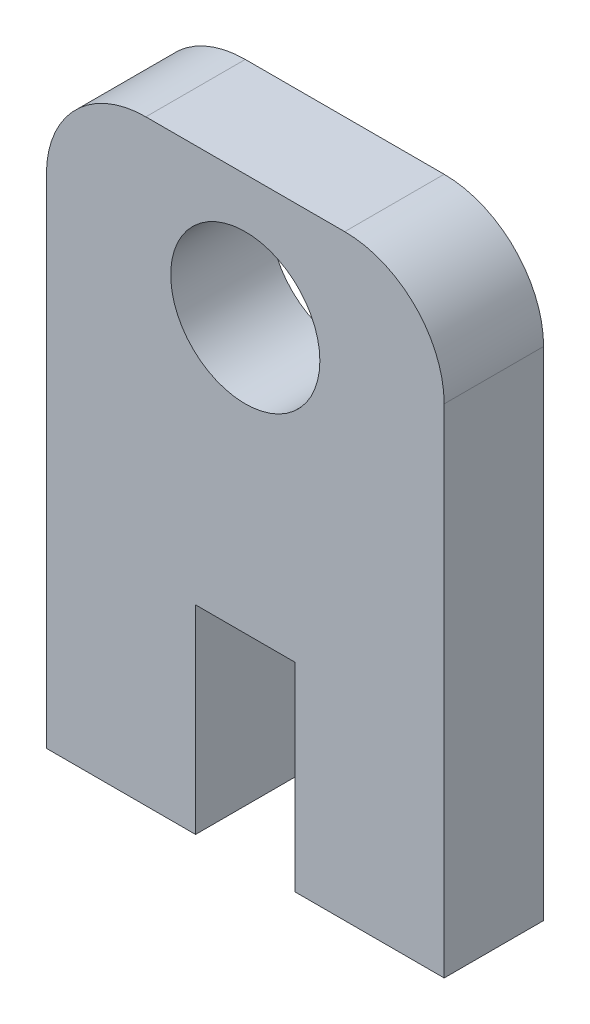
ISO-10303-21;
HEADER;
FILE_DESCRIPTION(('STEP AP214'),'2;1');
FILE_NAME('part.step','',(''),(''),'','','');
FILE_SCHEMA(('AUTOMOTIVE_DESIGN { 1 0 10303 214 1 1 1 1 }'));
ENDSEC;
DATA;
#1=APPLICATION_CONTEXT('core data for automotive mechanical design processes');
#2=APPLICATION_PROTOCOL_DEFINITION('international standard','automotive_design',2000,#1);
#3=PRODUCT_CONTEXT('',#1,'mechanical');
#4=PRODUCT('Part','Part','',(#3));
#5=PRODUCT_RELATED_PRODUCT_CATEGORY('part','',(#4));
#6=PRODUCT_DEFINITION_FORMATION('','',#4);
#7=PRODUCT_DEFINITION_CONTEXT('part definition',#1,'design');
#8=PRODUCT_DEFINITION('design','',#6,#7);
#9=PRODUCT_DEFINITION_SHAPE('','',#8);
#10=(LENGTH_UNIT() NAMED_UNIT(*) SI_UNIT(.MILLI.,.METRE.));
#11=(NAMED_UNIT(*) PLANE_ANGLE_UNIT() SI_UNIT($,.RADIAN.));
#12=(NAMED_UNIT(*) SI_UNIT($,.STERADIAN.) SOLID_ANGLE_UNIT());
#13=UNCERTAINTY_MEASURE_WITH_UNIT(LENGTH_MEASURE(1.E-05),#10,'distance_accuracy_value','');
#14=(GEOMETRIC_REPRESENTATION_CONTEXT(3) GLOBAL_UNCERTAINTY_ASSIGNED_CONTEXT((#13)) GLOBAL_UNIT_ASSIGNED_CONTEXT((#10,
#11,#12)) REPRESENTATION_CONTEXT('',''));
#15=CARTESIAN_POINT('',(0.,0.,0.));
#16=DIRECTION('',(0.,0.,1.));
#17=DIRECTION('',(1.,0.,0.));
#18=AXIS2_PLACEMENT_3D('',#15,#16,#17);
#19=CARTESIAN_POINT('',(0.,-1.58749999999999,3.175));
#20=DIRECTION('',(0.,1.,0.));
#21=DIRECTION('',(-1.,0.,0.));
#22=AXIS2_PLACEMENT_3D('',#19,#20,#21);
#23=PLANE('',#22);
#24=DIRECTION('',(1.,0.,0.));
#25=VECTOR('',#24,1.);
#26=CARTESIAN_POINT('',(0.,-1.58749999999999,0.));
#27=LINE('',#26,#25);
#28=CARTESIAN_POINT('',(176.041318128345,-1.58749999999999,0.));
#29=VERTEX_POINT('',#28);
#30=CARTESIAN_POINT('',(182.391318128345,-1.58749999999999,0.));
#31=VERTEX_POINT('',#30);
#32=EDGE_CURVE('E144',#29,#31,#27,.T.);
#33=ORIENTED_EDGE('',*,*,#32,.F.);
#34=DIRECTION('',(0.,0.,-1.));
#35=VECTOR('',#34,1.);
#36=CARTESIAN_POINT('',(176.041318128345,-1.58749999999999,3.175));
#37=LINE('',#36,#35);
#38=CARTESIAN_POINT('',(176.041318128345,-1.58749999999999,3.175));
#39=VERTEX_POINT('',#38);
#40=EDGE_CURVE('E11',#39,#29,#37,.T.);
#41=ORIENTED_EDGE('',*,*,#40,.F.);
#42=DIRECTION('',(1.,0.,0.));
#43=VECTOR('',#42,1.);
#44=CARTESIAN_POINT('',(0.,-1.58749999999999,3.175));
#45=LINE('',#44,#43);
#46=CARTESIAN_POINT('',(182.391318128345,-1.58749999999999,3.175));
#47=VERTEX_POINT('',#46);
#48=EDGE_CURVE('E234',#39,#47,#45,.T.);
#49=ORIENTED_EDGE('',*,*,#48,.T.);
#50=DIRECTION('',(0.,0.,-1.));
#51=VECTOR('',#50,1.);
#52=CARTESIAN_POINT('',(182.391318128345,-1.58749999999999,3.175));
#53=LINE('',#52,#51);
#54=EDGE_CURVE('E50',#47,#31,#53,.T.);
#55=ORIENTED_EDGE('',*,*,#54,.T.);
#56=EDGE_LOOP('',(#33,#41,#49,#55));
#57=FACE_BOUND('',#56,.T.);
#58=ADVANCED_FACE('F33',(#57),#23,.T.);
#59=CARTESIAN_POINT('',(176.041318128345,-4.7625,3.175));
#60=DIRECTION('',(0.,0.,-1.));
#61=DIRECTION('',(-1.,0.,0.));
#62=AXIS2_PLACEMENT_3D('',#59,#60,#61);
#63=CYLINDRICAL_SURFACE('',#62,3.17500000000001);
#64=CARTESIAN_POINT('',(176.041318128345,-4.7625,0.));
#65=DIRECTION('',(0.,0.,1.));
#66=DIRECTION('',(1.,0.,0.));
#67=AXIS2_PLACEMENT_3D('',#64,#65,#66);
#68=CIRCLE('',#67,3.17500000000001);
#69=CARTESIAN_POINT('',(172.866318128345,-4.76250000000002,0.));
#70=VERTEX_POINT('',#69);
#71=EDGE_CURVE('E146',#29,#70,#68,.T.);
#72=ORIENTED_EDGE('',*,*,#71,.T.);
#73=DIRECTION('',(0.,0.,-1.));
#74=VECTOR('',#73,1.);
#75=CARTESIAN_POINT('',(172.866318128345,-4.76250000000002,3.175));
#76=LINE('',#75,#74);
#77=CARTESIAN_POINT('',(172.866318128345,-4.76250000000002,3.175));
#78=VERTEX_POINT('',#77);
#79=EDGE_CURVE('E42',#78,#70,#76,.T.);
#80=ORIENTED_EDGE('',*,*,#79,.F.);
#81=CARTESIAN_POINT('',(176.041318128345,-4.7625,3.175));
#82=DIRECTION('',(0.,0.,1.));
#83=DIRECTION('',(1.,0.,0.));
#84=AXIS2_PLACEMENT_3D('',#81,#82,#83);
#85=CIRCLE('',#84,3.17500000000001);
#86=EDGE_CURVE('E236',#39,#78,#85,.T.);
#87=ORIENTED_EDGE('',*,*,#86,.F.);
#88=ORIENTED_EDGE('',*,*,#40,.T.);
#89=EDGE_LOOP('',(#72,#80,#87,#88));
#90=FACE_BOUND('',#89,.T.);
#91=ADVANCED_FACE('F193',(#90),#63,.T.);
#92=CARTESIAN_POINT('',(172.866318128345,0.,3.175));
#93=DIRECTION('',(1.,0.,0.));
#94=DIRECTION('',(0.,0.,-1.));
#95=AXIS2_PLACEMENT_3D('',#92,#93,#94);
#96=PLANE('',#95);
#97=DIRECTION('',(0.,-1.,0.));
#98=VECTOR('',#97,1.);
#99=CARTESIAN_POINT('',(172.866318128345,0.,0.));
#100=LINE('',#99,#98);
#101=CARTESIAN_POINT('',(172.866318128345,-20.6375,0.));
#102=VERTEX_POINT('',#101);
#103=EDGE_CURVE('E149',#70,#102,#100,.T.);
#104=ORIENTED_EDGE('',*,*,#103,.T.);
#105=DIRECTION('',(0.,0.,-1.));
#106=VECTOR('',#105,1.);
#107=CARTESIAN_POINT('',(172.866318128345,-20.6375,3.175));
#108=LINE('',#107,#106);
#109=CARTESIAN_POINT('',(172.866318128345,-20.6375,3.175));
#110=VERTEX_POINT('',#109);
#111=EDGE_CURVE('E181',#110,#102,#108,.T.);
#112=ORIENTED_EDGE('',*,*,#111,.F.);
#113=DIRECTION('',(0.,-1.,0.));
#114=VECTOR('',#113,1.);
#115=CARTESIAN_POINT('',(172.866318128345,0.,3.175));
#116=LINE('',#115,#114);
#117=EDGE_CURVE('E189',#78,#110,#116,.T.);
#118=ORIENTED_EDGE('',*,*,#117,.F.);
#119=ORIENTED_EDGE('',*,*,#79,.T.);
#120=EDGE_LOOP('',(#104,#112,#118,#119));
#121=FACE_BOUND('',#120,.T.);
#122=ADVANCED_FACE('F186',(#121),#96,.F.);
#123=CARTESIAN_POINT('',(0.,-20.6375,3.175));
#124=DIRECTION('',(0.,1.,0.));
#125=DIRECTION('',(0.,0.,1.));
#126=AXIS2_PLACEMENT_3D('',#123,#124,#125);
#127=PLANE('',#126);
#128=DIRECTION('',(1.,0.,0.));
#129=VECTOR('',#128,1.);
#130=CARTESIAN_POINT('',(0.,-20.6375,0.));
#131=LINE('',#130,#129);
#132=CARTESIAN_POINT('',(177.628818128345,-20.6375,0.));
#133=VERTEX_POINT('',#132);
#134=EDGE_CURVE('E152',#102,#133,#131,.T.);
#135=ORIENTED_EDGE('',*,*,#134,.T.);
#136=DIRECTION('',(0.,0.,-1.));
#137=VECTOR('',#136,1.);
#138=CARTESIAN_POINT('',(177.628818128345,-20.6375,3.175));
#139=LINE('',#138,#137);
#140=CARTESIAN_POINT('',(177.628818128345,-20.6375,3.175));
#141=VERTEX_POINT('',#140);
#142=EDGE_CURVE('E178',#141,#133,#139,.T.);
#143=ORIENTED_EDGE('',*,*,#142,.F.);
#144=DIRECTION('',(1.,0.,0.));
#145=VECTOR('',#144,1.);
#146=CARTESIAN_POINT('',(0.,-20.6375,3.175));
#147=LINE('',#146,#145);
#148=EDGE_CURVE('E124',#110,#141,#147,.T.);
#149=ORIENTED_EDGE('',*,*,#148,.F.);
#150=ORIENTED_EDGE('',*,*,#111,.T.);
#151=EDGE_LOOP('',(#135,#143,#149,#150));
#152=FACE_BOUND('',#151,.T.);
#153=ADVANCED_FACE('F204',(#152),#127,.F.);
#154=CARTESIAN_POINT('',(177.628818128345,0.,3.175));
#155=DIRECTION('',(-1.,0.,0.));
#156=DIRECTION('',(0.,0.,1.));
#157=AXIS2_PLACEMENT_3D('',#154,#155,#156);
#158=PLANE('',#157);
#159=DIRECTION('',(0.,1.,0.));
#160=VECTOR('',#159,1.);
#161=CARTESIAN_POINT('',(177.628818128345,0.,0.));
#162=LINE('',#161,#160);
#163=CARTESIAN_POINT('',(177.628818128345,-14.2875,0.));
#164=VERTEX_POINT('',#163);
#165=EDGE_CURVE('E155',#133,#164,#162,.T.);
#166=ORIENTED_EDGE('',*,*,#165,.T.);
#167=DIRECTION('',(0.,0.,-1.));
#168=VECTOR('',#167,1.);
#169=CARTESIAN_POINT('',(177.628818128345,-14.2875,3.175));
#170=LINE('',#169,#168);
#171=CARTESIAN_POINT('',(177.628818128345,-14.2875,3.175));
#172=VERTEX_POINT('',#171);
#173=EDGE_CURVE('E175',#172,#164,#170,.T.);
#174=ORIENTED_EDGE('',*,*,#173,.F.);
#175=DIRECTION('',(0.,1.,0.));
#176=VECTOR('',#175,1.);
#177=CARTESIAN_POINT('',(177.628818128345,0.,3.175));
#178=LINE('',#177,#176);
#179=EDGE_CURVE('E242',#141,#172,#178,.T.);
#180=ORIENTED_EDGE('',*,*,#179,.F.);
#181=ORIENTED_EDGE('',*,*,#142,.T.);
#182=EDGE_LOOP('',(#166,#174,#180,#181));
#183=FACE_BOUND('',#182,.T.);
#184=ADVANCED_FACE('F205',(#183),#158,.F.);
#185=CARTESIAN_POINT('',(0.,-14.2875,3.175));
#186=DIRECTION('',(0.,1.,0.));
#187=DIRECTION('',(0.,0.,1.));
#188=AXIS2_PLACEMENT_3D('',#185,#186,#187);
#189=PLANE('',#188);
#190=DIRECTION('',(1.,0.,0.));
#191=VECTOR('',#190,1.);
#192=CARTESIAN_POINT('',(0.,-14.2875,0.));
#193=LINE('',#192,#191);
#194=CARTESIAN_POINT('',(180.803818128345,-14.2875,0.));
#195=VERTEX_POINT('',#194);
#196=EDGE_CURVE('E158',#164,#195,#193,.T.);
#197=ORIENTED_EDGE('',*,*,#196,.T.);
#198=DIRECTION('',(0.,0.,-1.));
#199=VECTOR('',#198,1.);
#200=CARTESIAN_POINT('',(180.803818128345,-14.2875,3.175));
#201=LINE('',#200,#199);
#202=CARTESIAN_POINT('',(180.803818128345,-14.2875,3.175));
#203=VERTEX_POINT('',#202);
#204=EDGE_CURVE('E173',#203,#195,#201,.T.);
#205=ORIENTED_EDGE('',*,*,#204,.F.);
#206=DIRECTION('',(1.,0.,0.));
#207=VECTOR('',#206,1.);
#208=CARTESIAN_POINT('',(0.,-14.2875,3.175));
#209=LINE('',#208,#207);
#210=EDGE_CURVE('E244',#172,#203,#209,.T.);
#211=ORIENTED_EDGE('',*,*,#210,.F.);
#212=ORIENTED_EDGE('',*,*,#173,.T.);
#213=EDGE_LOOP('',(#197,#205,#211,#212));
#214=FACE_BOUND('',#213,.T.);
#215=ADVANCED_FACE('F208',(#214),#189,.F.);
#216=CARTESIAN_POINT('',(180.803818128345,0.,3.175));
#217=DIRECTION('',(-1.,0.,0.));
#218=DIRECTION('',(0.,0.,1.));
#219=AXIS2_PLACEMENT_3D('',#216,#217,#218);
#220=PLANE('',#219);
#221=DIRECTION('',(0.,1.,0.));
#222=VECTOR('',#221,1.);
#223=CARTESIAN_POINT('',(180.803818128345,0.,0.));
#224=LINE('',#223,#222);
#225=CARTESIAN_POINT('',(180.803818128345,-20.6375,0.));
#226=VERTEX_POINT('',#225);
#227=EDGE_CURVE('E161',#226,#195,#224,.T.);
#228=ORIENTED_EDGE('',*,*,#227,.F.);
#229=DIRECTION('',(0.,0.,-1.));
#230=VECTOR('',#229,1.);
#231=CARTESIAN_POINT('',(180.803818128345,-20.6375,3.175));
#232=LINE('',#231,#230);
#233=CARTESIAN_POINT('',(180.803818128345,-20.6375,3.175));
#234=VERTEX_POINT('',#233);
#235=EDGE_CURVE('E132',#234,#226,#232,.T.);
#236=ORIENTED_EDGE('',*,*,#235,.F.);
#237=DIRECTION('',(0.,1.,0.));
#238=VECTOR('',#237,1.);
#239=CARTESIAN_POINT('',(180.803818128345,0.,3.175));
#240=LINE('',#239,#238);
#241=EDGE_CURVE('E121',#234,#203,#240,.T.);
#242=ORIENTED_EDGE('',*,*,#241,.T.);
#243=ORIENTED_EDGE('',*,*,#204,.T.);
#244=EDGE_LOOP('',(#228,#236,#242,#243));
#245=FACE_BOUND('',#244,.T.);
#246=ADVANCED_FACE('F212',(#245),#220,.T.);
#247=CARTESIAN_POINT('',(185.566318128345,-20.6375,0.));
#248=VERTEX_POINT('',#247);
#249=EDGE_CURVE('E129',#226,#248,#131,.T.);
#250=ORIENTED_EDGE('',*,*,#249,.T.);
#251=DIRECTION('',(0.,0.,-1.));
#252=VECTOR('',#251,1.);
#253=CARTESIAN_POINT('',(185.566318128345,-20.6375,3.175));
#254=LINE('',#253,#252);
#255=CARTESIAN_POINT('',(185.566318128345,-20.6375,3.175));
#256=VERTEX_POINT('',#255);
#257=EDGE_CURVE('E126',#256,#248,#254,.T.);
#258=ORIENTED_EDGE('',*,*,#257,.F.);
#259=EDGE_CURVE('E113',#234,#256,#147,.T.);
#260=ORIENTED_EDGE('',*,*,#259,.F.);
#261=ORIENTED_EDGE('',*,*,#235,.T.);
#262=EDGE_LOOP('',(#250,#258,#260,#261));
#263=FACE_BOUND('',#262,.T.);
#264=ADVANCED_FACE('F127',(#263),#127,.F.);
#265=CARTESIAN_POINT('',(185.566318128345,0.,3.175));
#266=DIRECTION('',(1.,0.,0.));
#267=DIRECTION('',(0.,0.,-1.));
#268=AXIS2_PLACEMENT_3D('',#265,#266,#267);
#269=PLANE('',#268);
#270=DIRECTION('',(0.,-1.,0.));
#271=VECTOR('',#270,1.);
#272=CARTESIAN_POINT('',(185.566318128345,0.,0.));
#273=LINE('',#272,#271);
#274=CARTESIAN_POINT('',(185.566318128345,-4.76250000000002,0.));
#275=VERTEX_POINT('',#274);
#276=EDGE_CURVE('E164',#275,#248,#273,.T.);
#277=ORIENTED_EDGE('',*,*,#276,.F.);
#278=DIRECTION('',(0.,0.,-1.));
#279=VECTOR('',#278,1.);
#280=CARTESIAN_POINT('',(185.566318128345,-4.76250000000002,3.175));
#281=LINE('',#280,#279);
#282=CARTESIAN_POINT('',(185.566318128345,-4.76250000000002,3.175));
#283=VERTEX_POINT('',#282);
#284=EDGE_CURVE('E81',#283,#275,#281,.T.);
#285=ORIENTED_EDGE('',*,*,#284,.F.);
#286=DIRECTION('',(0.,-1.,0.));
#287=VECTOR('',#286,1.);
#288=CARTESIAN_POINT('',(185.566318128345,0.,3.175));
#289=LINE('',#288,#287);
#290=EDGE_CURVE('E119',#283,#256,#289,.T.);
#291=ORIENTED_EDGE('',*,*,#290,.T.);
#292=ORIENTED_EDGE('',*,*,#257,.T.);
#293=EDGE_LOOP('',(#277,#285,#291,#292));
#294=FACE_BOUND('',#293,.T.);
#295=ADVANCED_FACE('F134',(#294),#269,.T.);
#296=CARTESIAN_POINT('',(179.216318128345,-5.55624999999998,3.175));
#297=DIRECTION('',(0.,0.,-1.));
#298=DIRECTION('',(-1.,0.,0.));
#299=AXIS2_PLACEMENT_3D('',#296,#297,#298);
#300=CYLINDRICAL_SURFACE('',#299,2.38125000000001);
#301=CARTESIAN_POINT('',(179.216318128345,-5.55624999999998,3.175));
#302=DIRECTION('',(0.,0.,1.));
#303=DIRECTION('',(1.,0.,0.));
#304=AXIS2_PLACEMENT_3D('',#301,#302,#303);
#305=CIRCLE('',#304,2.38125000000001);
#306=CARTESIAN_POINT('',(181.597568128345,-5.55624999999998,3.175));
#307=VERTEX_POINT('',#306);
#308=EDGE_CURVE('E169',#307,#307,#305,.T.);
#309=ORIENTED_EDGE('',*,*,#308,.T.);
#310=EDGE_LOOP('',(#309));
#311=FACE_BOUND('',#310,.T.);
#312=CARTESIAN_POINT('',(179.216318128345,-5.55624999999998,0.));
#313=DIRECTION('',(0.,0.,1.));
#314=DIRECTION('',(1.,0.,0.));
#315=AXIS2_PLACEMENT_3D('',#312,#313,#314);
#316=CIRCLE('',#315,2.38125000000001);
#317=CARTESIAN_POINT('',(181.597568128345,-5.55624999999998,0.));
#318=VERTEX_POINT('',#317);
#319=EDGE_CURVE('E141',#318,#318,#316,.T.);
#320=ORIENTED_EDGE('',*,*,#319,.F.);
#321=EDGE_LOOP('',(#320));
#322=FACE_BOUND('',#321,.T.);
#323=ADVANCED_FACE('F35',(#311,#322),#300,.F.);
#324=CARTESIAN_POINT('',(182.391318128345,-4.7625,3.175));
#325=DIRECTION('',(0.,0.,-1.));
#326=DIRECTION('',(-1.,0.,0.));
#327=AXIS2_PLACEMENT_3D('',#324,#325,#326);
#328=CYLINDRICAL_SURFACE('',#327,3.17500000000001);
#329=CARTESIAN_POINT('',(182.391318128345,-4.7625,0.));
#330=DIRECTION('',(0.,0.,1.));
#331=DIRECTION('',(1.,0.,0.));
#332=AXIS2_PLACEMENT_3D('',#329,#330,#331);
#333=CIRCLE('',#332,3.17500000000001);
#334=EDGE_CURVE('E166',#31,#275,#333,.F.);
#335=ORIENTED_EDGE('',*,*,#334,.F.);
#336=ORIENTED_EDGE('',*,*,#54,.F.);
#337=CARTESIAN_POINT('',(182.391318128345,-4.7625,3.175));
#338=DIRECTION('',(0.,0.,1.));
#339=DIRECTION('',(1.,0.,0.));
#340=AXIS2_PLACEMENT_3D('',#337,#338,#339);
#341=CIRCLE('',#340,3.17500000000001);
#342=EDGE_CURVE('E135',#47,#283,#341,.F.);
#343=ORIENTED_EDGE('',*,*,#342,.T.);
#344=ORIENTED_EDGE('',*,*,#284,.T.);
#345=EDGE_LOOP('',(#335,#336,#343,#344));
#346=FACE_BOUND('',#345,.T.);
#347=ADVANCED_FACE('F221',(#346),#328,.T.);
#348=CARTESIAN_POINT('',(0.,0.,3.175));
#349=DIRECTION('',(0.,0.,1.));
#350=DIRECTION('',(1.,0.,0.));
#351=AXIS2_PLACEMENT_3D('',#348,#349,#350);
#352=PLANE('',#351);
#353=ORIENTED_EDGE('',*,*,#308,.F.);
#354=EDGE_LOOP('',(#353));
#355=FACE_BOUND('',#354,.T.);
#356=ORIENTED_EDGE('',*,*,#48,.F.);
#357=ORIENTED_EDGE('',*,*,#86,.T.);
#358=ORIENTED_EDGE('',*,*,#117,.T.);
#359=ORIENTED_EDGE('',*,*,#148,.T.);
#360=ORIENTED_EDGE('',*,*,#179,.T.);
#361=ORIENTED_EDGE('',*,*,#210,.T.);
#362=ORIENTED_EDGE('',*,*,#241,.F.);
#363=ORIENTED_EDGE('',*,*,#259,.T.);
#364=ORIENTED_EDGE('',*,*,#290,.F.);
#365=ORIENTED_EDGE('',*,*,#342,.F.);
#366=EDGE_LOOP('',(#356,#357,#358,#359,#360,#361,#362,#363,#364,#365));
#367=FACE_BOUND('',#366,.T.);
#368=ADVANCED_FACE('F116',(#355,#367),#352,.T.);
#369=CARTESIAN_POINT('',(0.,0.,0.));
#370=DIRECTION('',(0.,0.,1.));
#371=DIRECTION('',(1.,0.,0.));
#372=AXIS2_PLACEMENT_3D('',#369,#370,#371);
#373=PLANE('',#372);
#374=ORIENTED_EDGE('',*,*,#319,.T.);
#375=EDGE_LOOP('',(#374));
#376=FACE_BOUND('',#375,.T.);
#377=ORIENTED_EDGE('',*,*,#32,.T.);
#378=ORIENTED_EDGE('',*,*,#334,.T.);
#379=ORIENTED_EDGE('',*,*,#276,.T.);
#380=ORIENTED_EDGE('',*,*,#249,.F.);
#381=ORIENTED_EDGE('',*,*,#227,.T.);
#382=ORIENTED_EDGE('',*,*,#196,.F.);
#383=ORIENTED_EDGE('',*,*,#165,.F.);
#384=ORIENTED_EDGE('',*,*,#134,.F.);
#385=ORIENTED_EDGE('',*,*,#103,.F.);
#386=ORIENTED_EDGE('',*,*,#71,.F.);
#387=EDGE_LOOP('',(#377,#378,#379,#380,#381,#382,#383,#384,#385,#386));
#388=FACE_BOUND('',#387,.T.);
#389=ADVANCED_FACE('F195',(#376,#388),#373,.F.);
#390=CLOSED_SHELL('',(#58,#91,#122,#153,#184,#215,#246,#264,#295,#323,#347,#368,#389));
#391=MANIFOLD_SOLID_BREP('B2',#390);
#392=ADVANCED_BREP_SHAPE_REPRESENTATION('',(#18,#391),#14);
#393=SHAPE_DEFINITION_REPRESENTATION(#9,#392);
ENDSEC;
END-ISO-10303-21;
